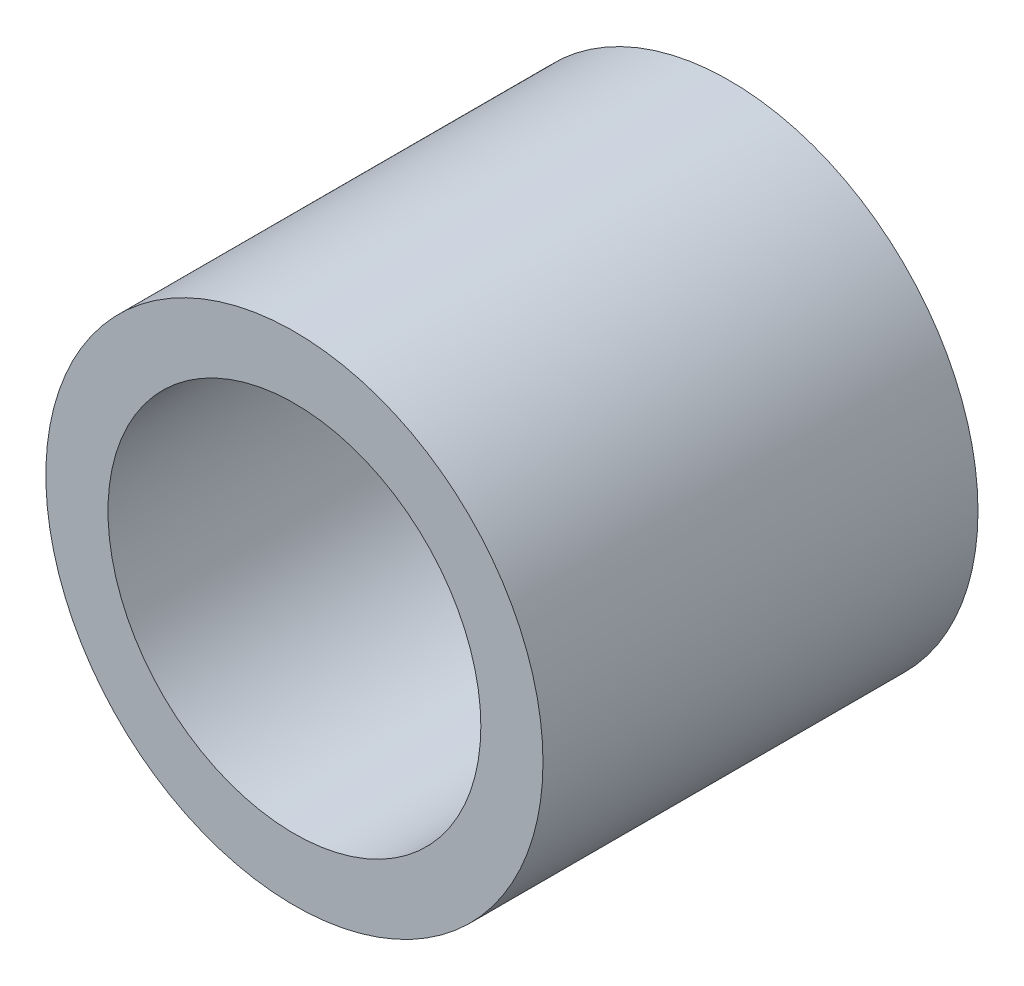
ISO-10303-21;
HEADER;
FILE_DESCRIPTION(('STEP AP214'),'2;1');
FILE_NAME('part.step','',(''),(''),'','','');
FILE_SCHEMA(('AUTOMOTIVE_DESIGN { 1 0 10303 214 1 1 1 1 }'));
ENDSEC;
DATA;
#1=APPLICATION_CONTEXT('core data for automotive mechanical design processes');
#2=APPLICATION_PROTOCOL_DEFINITION('international standard','automotive_design',2000,#1);
#3=PRODUCT_CONTEXT('',#1,'mechanical');
#4=PRODUCT('Part','Part','',(#3));
#5=PRODUCT_RELATED_PRODUCT_CATEGORY('part','',(#4));
#6=PRODUCT_DEFINITION_FORMATION('','',#4);
#7=PRODUCT_DEFINITION_CONTEXT('part definition',#1,'design');
#8=PRODUCT_DEFINITION('design','',#6,#7);
#9=PRODUCT_DEFINITION_SHAPE('','',#8);
#10=(LENGTH_UNIT() NAMED_UNIT(*) SI_UNIT(.MILLI.,.METRE.));
#11=(NAMED_UNIT(*) PLANE_ANGLE_UNIT() SI_UNIT($,.RADIAN.));
#12=(NAMED_UNIT(*) SI_UNIT($,.STERADIAN.) SOLID_ANGLE_UNIT());
#13=UNCERTAINTY_MEASURE_WITH_UNIT(LENGTH_MEASURE(1.E-05),#10,'distance_accuracy_value','');
#14=(GEOMETRIC_REPRESENTATION_CONTEXT(3) GLOBAL_UNCERTAINTY_ASSIGNED_CONTEXT((#13)) GLOBAL_UNIT_ASSIGNED_CONTEXT((#10,
#11,#12)) REPRESENTATION_CONTEXT('',''));
#15=CARTESIAN_POINT('',(0.,0.,0.));
#16=DIRECTION('',(0.,0.,1.));
#17=DIRECTION('',(1.,0.,0.));
#18=AXIS2_PLACEMENT_3D('',#15,#16,#17);
#19=CARTESIAN_POINT('',(0.,0.,17.5));
#20=DIRECTION('',(0.,0.,1.));
#21=DIRECTION('',(1.,0.,0.));
#22=AXIS2_PLACEMENT_3D('',#19,#20,#21);
#23=PLANE('',#22);
#24=CARTESIAN_POINT('',(0.,0.,17.5));
#25=DIRECTION('',(0.,0.,1.));
#26=DIRECTION('',(1.,0.,0.));
#27=AXIS2_PLACEMENT_3D('',#24,#25,#26);
#28=CIRCLE('',#27,20.);
#29=CARTESIAN_POINT('',(20.,0.,17.5));
#30=VERTEX_POINT('',#29);
#31=EDGE_CURVE('E10',#30,#30,#28,.T.);
#32=ORIENTED_EDGE('',*,*,#31,.T.);
#33=EDGE_LOOP('',(#32));
#34=FACE_BOUND('',#33,.T.);
#35=CARTESIAN_POINT('',(0.,0.,17.5));
#36=DIRECTION('',(0.,0.,1.));
#37=DIRECTION('',(1.,0.,0.));
#38=AXIS2_PLACEMENT_3D('',#35,#36,#37);
#39=CIRCLE('',#38,15.);
#40=CARTESIAN_POINT('',(15.,0.,17.5));
#41=VERTEX_POINT('',#40);
#42=EDGE_CURVE('E41',#41,#41,#39,.T.);
#43=ORIENTED_EDGE('',*,*,#42,.F.);
#44=EDGE_LOOP('',(#43));
#45=FACE_BOUND('',#44,.T.);
#46=ADVANCED_FACE('F30',(#34,#45),#23,.T.);
#47=CARTESIAN_POINT('',(0.,0.,-17.5));
#48=DIRECTION('',(0.,0.,1.));
#49=DIRECTION('',(1.,0.,0.));
#50=AXIS2_PLACEMENT_3D('',#47,#48,#49);
#51=PLANE('',#50);
#52=CARTESIAN_POINT('',(0.,0.,-17.5));
#53=DIRECTION('',(0.,0.,1.));
#54=DIRECTION('',(1.,0.,0.));
#55=AXIS2_PLACEMENT_3D('',#52,#53,#54);
#56=CIRCLE('',#55,20.);
#57=CARTESIAN_POINT('',(20.,0.,-17.5));
#58=VERTEX_POINT('',#57);
#59=EDGE_CURVE('E34',#58,#58,#56,.T.);
#60=ORIENTED_EDGE('',*,*,#59,.F.);
#61=EDGE_LOOP('',(#60));
#62=FACE_BOUND('',#61,.T.);
#63=CARTESIAN_POINT('',(0.,0.,-17.5));
#64=DIRECTION('',(0.,0.,1.));
#65=DIRECTION('',(1.,0.,0.));
#66=AXIS2_PLACEMENT_3D('',#63,#64,#65);
#67=CIRCLE('',#66,15.);
#68=CARTESIAN_POINT('',(15.,0.,-17.5));
#69=VERTEX_POINT('',#68);
#70=EDGE_CURVE('E43',#69,#69,#67,.T.);
#71=ORIENTED_EDGE('',*,*,#70,.T.);
#72=EDGE_LOOP('',(#71));
#73=FACE_BOUND('',#72,.T.);
#74=ADVANCED_FACE('F53',(#62,#73),#51,.F.);
#75=CARTESIAN_POINT('',(0.,0.,17.5));
#76=DIRECTION('',(0.,0.,-1.));
#77=DIRECTION('',(-1.,0.,0.));
#78=AXIS2_PLACEMENT_3D('',#75,#76,#77);
#79=CYLINDRICAL_SURFACE('',#78,20.);
#80=ORIENTED_EDGE('',*,*,#31,.F.);
#81=EDGE_LOOP('',(#80));
#82=FACE_BOUND('',#81,.T.);
#83=ORIENTED_EDGE('',*,*,#59,.T.);
#84=EDGE_LOOP('',(#83));
#85=FACE_BOUND('',#84,.T.);
#86=ADVANCED_FACE('F32',(#82,#85),#79,.T.);
#87=CARTESIAN_POINT('',(0.,0.,17.5));
#88=DIRECTION('',(0.,0.,-1.));
#89=DIRECTION('',(-1.,0.,0.));
#90=AXIS2_PLACEMENT_3D('',#87,#88,#89);
#91=CYLINDRICAL_SURFACE('',#90,15.);
#92=ORIENTED_EDGE('',*,*,#42,.T.);
#93=EDGE_LOOP('',(#92));
#94=FACE_BOUND('',#93,.T.);
#95=ORIENTED_EDGE('',*,*,#70,.F.);
#96=EDGE_LOOP('',(#95));
#97=FACE_BOUND('',#96,.T.);
#98=ADVANCED_FACE('F49',(#94,#97),#91,.F.);
#99=CLOSED_SHELL('',(#46,#74,#86,#98));
#100=MANIFOLD_SOLID_BREP('B2',#99);
#101=ADVANCED_BREP_SHAPE_REPRESENTATION('',(#18,#100),#14);
#102=SHAPE_DEFINITION_REPRESENTATION(#9,#101);
ENDSEC;
END-ISO-10303-21;
